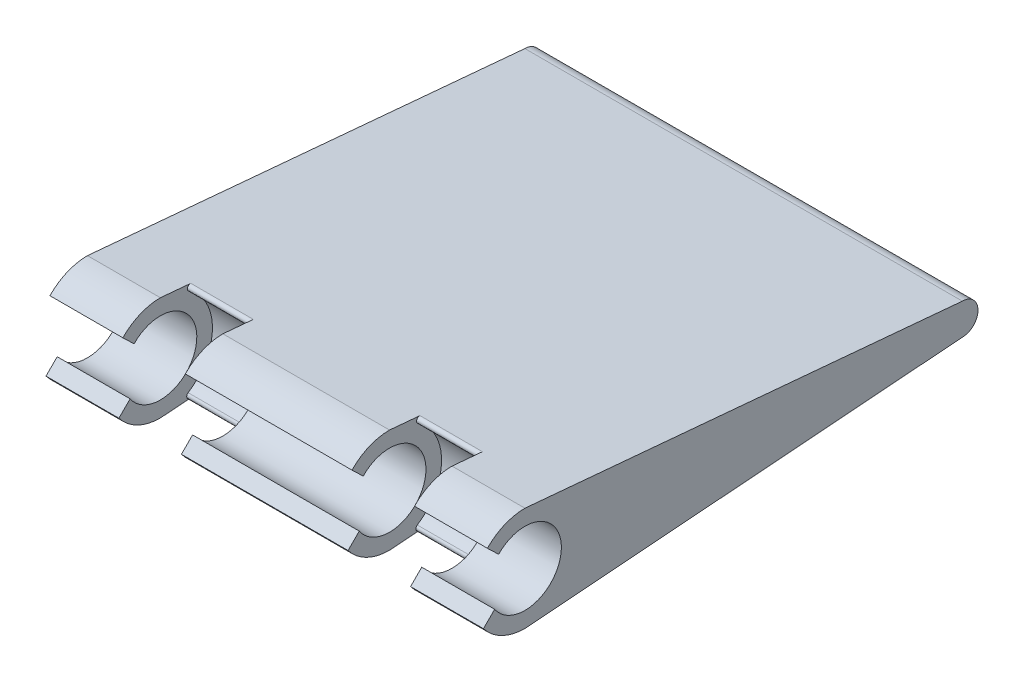
ISO-10303-21;
HEADER;
FILE_DESCRIPTION(('STEP AP214'),'2;1');
FILE_NAME('part.step','',(''),(''),'','','');
FILE_SCHEMA(('AUTOMOTIVE_DESIGN { 1 0 10303 214 1 1 1 1 }'));
ENDSEC;
DATA;
#1=APPLICATION_CONTEXT('core data for automotive mechanical design processes');
#2=APPLICATION_PROTOCOL_DEFINITION('international standard','automotive_design',2000,#1);
#3=PRODUCT_CONTEXT('',#1,'mechanical');
#4=PRODUCT('Part','Part','',(#3));
#5=PRODUCT_RELATED_PRODUCT_CATEGORY('part','',(#4));
#6=PRODUCT_DEFINITION_FORMATION('','',#4);
#7=PRODUCT_DEFINITION_CONTEXT('part definition',#1,'design');
#8=PRODUCT_DEFINITION('design','',#6,#7);
#9=PRODUCT_DEFINITION_SHAPE('','',#8);
#10=(LENGTH_UNIT() NAMED_UNIT(*) SI_UNIT(.MILLI.,.METRE.));
#11=(NAMED_UNIT(*) PLANE_ANGLE_UNIT() SI_UNIT($,.RADIAN.));
#12=(NAMED_UNIT(*) SI_UNIT($,.STERADIAN.) SOLID_ANGLE_UNIT());
#13=UNCERTAINTY_MEASURE_WITH_UNIT(LENGTH_MEASURE(1.E-05),#10,'distance_accuracy_value','');
#14=(GEOMETRIC_REPRESENTATION_CONTEXT(3) GLOBAL_UNCERTAINTY_ASSIGNED_CONTEXT((#13)) GLOBAL_UNIT_ASSIGNED_CONTEXT((#10,
#11,#12)) REPRESENTATION_CONTEXT('',''));
#15=CARTESIAN_POINT('',(0.,0.,0.));
#16=DIRECTION('',(0.,0.,1.));
#17=DIRECTION('',(1.,0.,0.));
#18=AXIS2_PLACEMENT_3D('',#15,#16,#17);
#19=CARTESIAN_POINT('',(21.,0.,0.));
#20=DIRECTION('',(-1.,0.,0.));
#21=DIRECTION('',(0.,0.,1.));
#22=AXIS2_PLACEMENT_3D('',#19,#20,#21);
#23=CYLINDRICAL_SURFACE('',#22,5.);
#24=CARTESIAN_POINT('',(-21.,0.,0.));
#25=DIRECTION('',(1.,0.,0.));
#26=DIRECTION('',(0.,0.,-1.));
#27=AXIS2_PLACEMENT_3D('',#24,#25,#26);
#28=CIRCLE('',#27,5.);
#29=CARTESIAN_POINT('',(-21.,5.,0.));
#30=VERTEX_POINT('',#29);
#31=CARTESIAN_POINT('',(-21.,3.46769077619683,3.60209948234074));
#32=VERTEX_POINT('',#31);
#33=EDGE_CURVE('E343',#30,#32,#28,.T.);
#34=ORIENTED_EDGE('',*,*,#33,.T.);
#35=DIRECTION('',(1.,0.,0.));
#36=VECTOR('',#35,1.);
#37=CARTESIAN_POINT('',(-27.9512556912177,3.46769077619683,3.60209948234074));
#38=LINE('',#37,#36);
#39=CARTESIAN_POINT('',(-14.,3.46769077619683,3.60209948234074));
#40=VERTEX_POINT('',#39);
#41=EDGE_CURVE('E529',#32,#40,#38,.T.);
#42=ORIENTED_EDGE('',*,*,#41,.T.);
#43=CARTESIAN_POINT('',(-14.,0.,0.));
#44=DIRECTION('',(1.,0.,0.));
#45=DIRECTION('',(0.,0.,-1.));
#46=AXIS2_PLACEMENT_3D('',#43,#44,#45);
#47=CIRCLE('',#46,5.);
#48=CARTESIAN_POINT('',(-14.,5.,0.));
#49=VERTEX_POINT('',#48);
#50=EDGE_CURVE('E432',#49,#40,#47,.T.);
#51=ORIENTED_EDGE('',*,*,#50,.F.);
#52=DIRECTION('',(-1.,0.,0.));
#53=VECTOR('',#52,1.);
#54=CARTESIAN_POINT('',(21.,5.,0.));
#55=LINE('',#54,#53);
#56=EDGE_CURVE('E351',#49,#30,#55,.T.);
#57=ORIENTED_EDGE('',*,*,#56,.T.);
#58=EDGE_LOOP('',(#34,#42,#51,#57));
#59=FACE_BOUND('',#58,.T.);
#60=ADVANCED_FACE('F115',(#59),#23,.T.);
#61=CARTESIAN_POINT('',(-8.,0.,0.));
#62=DIRECTION('',(1.,0.,0.));
#63=DIRECTION('',(0.,0.,-1.));
#64=AXIS2_PLACEMENT_3D('',#61,#62,#63);
#65=CIRCLE('',#64,5.);
#66=CARTESIAN_POINT('',(-8.,5.,0.));
#67=VERTEX_POINT('',#66);
#68=CARTESIAN_POINT('',(-8.,3.46769077619683,3.60209948234074));
#69=VERTEX_POINT('',#68);
#70=EDGE_CURVE('E427',#67,#69,#65,.T.);
#71=ORIENTED_EDGE('',*,*,#70,.T.);
#72=CARTESIAN_POINT('',(8.,3.46769077619683,3.60209948234074));
#73=VERTEX_POINT('',#72);
#74=EDGE_CURVE('E518',#69,#73,#38,.T.);
#75=ORIENTED_EDGE('',*,*,#74,.T.);
#76=CARTESIAN_POINT('',(8.,0.,0.));
#77=DIRECTION('',(1.,0.,0.));
#78=DIRECTION('',(0.,0.,-1.));
#79=AXIS2_PLACEMENT_3D('',#76,#77,#78);
#80=CIRCLE('',#79,5.);
#81=CARTESIAN_POINT('',(8.,5.,0.));
#82=VERTEX_POINT('',#81);
#83=EDGE_CURVE('E459',#82,#73,#80,.T.);
#84=ORIENTED_EDGE('',*,*,#83,.F.);
#85=EDGE_CURVE('E357',#82,#67,#55,.T.);
#86=ORIENTED_EDGE('',*,*,#85,.T.);
#87=EDGE_LOOP('',(#71,#75,#84,#86));
#88=FACE_BOUND('',#87,.T.);
#89=ADVANCED_FACE('F526',(#88),#23,.T.);
#90=CARTESIAN_POINT('',(14.,0.,0.));
#91=DIRECTION('',(1.,0.,0.));
#92=DIRECTION('',(0.,0.,-1.));
#93=AXIS2_PLACEMENT_3D('',#90,#91,#92);
#94=CIRCLE('',#93,5.);
#95=CARTESIAN_POINT('',(14.,5.,0.));
#96=VERTEX_POINT('',#95);
#97=CARTESIAN_POINT('',(14.,3.46769077619683,3.60209948234074));
#98=VERTEX_POINT('',#97);
#99=EDGE_CURVE('E463',#96,#98,#94,.T.);
#100=ORIENTED_EDGE('',*,*,#99,.T.);
#101=CARTESIAN_POINT('',(21.,3.46769077619683,3.60209948234074));
#102=VERTEX_POINT('',#101);
#103=EDGE_CURVE('E130',#98,#102,#38,.T.);
#104=ORIENTED_EDGE('',*,*,#103,.T.);
#105=CARTESIAN_POINT('',(21.,0.,0.));
#106=DIRECTION('',(1.,0.,0.));
#107=DIRECTION('',(0.,0.,-1.));
#108=AXIS2_PLACEMENT_3D('',#105,#106,#107);
#109=CIRCLE('',#108,5.);
#110=CARTESIAN_POINT('',(21.,5.,0.));
#111=VERTEX_POINT('',#110);
#112=EDGE_CURVE('E323',#111,#102,#109,.T.);
#113=ORIENTED_EDGE('',*,*,#112,.F.);
#114=EDGE_CURVE('E353',#111,#96,#55,.T.);
#115=ORIENTED_EDGE('',*,*,#114,.T.);
#116=EDGE_LOOP('',(#100,#104,#113,#115));
#117=FACE_BOUND('',#116,.T.);
#118=ADVANCED_FACE('F490',(#117),#23,.T.);
#119=CARTESIAN_POINT('',(-14.,-3.02667931854972,3.97985078899491));
#120=VERTEX_POINT('',#119);
#121=CARTESIAN_POINT('',(-14.,-5.,0.));
#122=VERTEX_POINT('',#121);
#123=EDGE_CURVE('E430',#120,#122,#47,.T.);
#124=ORIENTED_EDGE('',*,*,#123,.F.);
#125=DIRECTION('',(1.,0.,0.));
#126=VECTOR('',#125,1.);
#127=CARTESIAN_POINT('',(-27.9512556912177,-3.02667931854972,3.97985078899491));
#128=LINE('',#127,#126);
#129=CARTESIAN_POINT('',(-21.,-3.02667931854972,3.97985078899491));
#130=VERTEX_POINT('',#129);
#131=EDGE_CURVE('E308',#130,#120,#128,.T.);
#132=ORIENTED_EDGE('',*,*,#131,.F.);
#133=CARTESIAN_POINT('',(-21.,-5.,0.));
#134=VERTEX_POINT('',#133);
#135=EDGE_CURVE('E342',#130,#134,#28,.T.);
#136=ORIENTED_EDGE('',*,*,#135,.T.);
#137=DIRECTION('',(-1.,0.,0.));
#138=VECTOR('',#137,1.);
#139=CARTESIAN_POINT('',(21.,-5.,0.));
#140=LINE('',#139,#138);
#141=EDGE_CURVE('E332',#122,#134,#140,.T.);
#142=ORIENTED_EDGE('',*,*,#141,.F.);
#143=EDGE_LOOP('',(#124,#132,#136,#142));
#144=FACE_BOUND('',#143,.T.);
#145=ADVANCED_FACE('F603',(#144),#23,.T.);
#146=CARTESIAN_POINT('',(21.,0.,0.));
#147=DIRECTION('',(-1.,0.,0.));
#148=DIRECTION('',(0.,0.,1.));
#149=AXIS2_PLACEMENT_3D('',#146,#147,#148);
#150=CYLINDRICAL_SURFACE('',#149,3.5);
#151=DIRECTION('',(1.,0.,0.));
#152=VECTOR('',#151,1.);
#153=CARTESIAN_POINT('',(-27.9512556912177,2.42738354333778,2.52146963763852));
#154=LINE('',#153,#152);
#155=CARTESIAN_POINT('',(-21.,2.42738354333778,2.52146963763852));
#156=VERTEX_POINT('',#155);
#157=CARTESIAN_POINT('',(-14.,2.42738354333778,2.52146963763852));
#158=VERTEX_POINT('',#157);
#159=EDGE_CURVE('E498',#156,#158,#154,.T.);
#160=ORIENTED_EDGE('',*,*,#159,.F.);
#161=CARTESIAN_POINT('',(-21.,0.,0.));
#162=DIRECTION('',(1.,0.,0.));
#163=DIRECTION('',(0.,0.,-1.));
#164=AXIS2_PLACEMENT_3D('',#161,#162,#163);
#165=CIRCLE('',#164,3.5);
#166=CARTESIAN_POINT('',(-21.,-1.95196651601317,2.90513798645837));
#167=VERTEX_POINT('',#166);
#168=EDGE_CURVE('E346',#167,#156,#165,.T.);
#169=ORIENTED_EDGE('',*,*,#168,.F.);
#170=DIRECTION('',(1.,0.,0.));
#171=VECTOR('',#170,1.);
#172=CARTESIAN_POINT('',(-27.9512556912177,-1.95196651601317,2.90513798645837));
#173=LINE('',#172,#171);
#174=CARTESIAN_POINT('',(-14.,-1.95196651601317,2.90513798645837));
#175=VERTEX_POINT('',#174);
#176=EDGE_CURVE('E408',#167,#175,#173,.T.);
#177=ORIENTED_EDGE('',*,*,#176,.T.);
#178=CARTESIAN_POINT('',(-14.,0.,0.));
#179=DIRECTION('',(1.,0.,0.));
#180=DIRECTION('',(0.,0.,-1.));
#181=AXIS2_PLACEMENT_3D('',#178,#179,#180);
#182=CIRCLE('',#181,3.5);
#183=EDGE_CURVE('E419',#175,#158,#182,.T.);
#184=ORIENTED_EDGE('',*,*,#183,.T.);
#185=EDGE_LOOP('',(#160,#169,#177,#184));
#186=FACE_BOUND('',#185,.T.);
#187=ADVANCED_FACE('F418',(#186),#150,.F.);
#188=CARTESIAN_POINT('',(21.,-4.97080969716975,-0.380919204519723));
#189=DIRECTION('',(0.,0.997076696866369,0.0764072023179126));
#190=DIRECTION('',(0.,-0.0764072023179126,0.997076696866369));
#191=AXIS2_PLACEMENT_3D('',#188,#189,#190);
#192=PLANE('',#191);
#193=DIRECTION('',(0.,0.0764072023179126,-0.997076696866369));
#194=VECTOR('',#193,1.);
#195=CARTESIAN_POINT('',(14.,-4.97080969716975,-0.380919204519723));
#196=LINE('',#195,#194);
#197=CARTESIAN_POINT('',(14.,-5.,0.));
#198=VERTEX_POINT('',#197);
#199=CARTESIAN_POINT('',(14.,-4.78152357006746,-2.85101077505653));
#200=VERTEX_POINT('',#199);
#201=EDGE_CURVE('E473',#198,#200,#196,.T.);
#202=ORIENTED_EDGE('',*,*,#201,.T.);
#203=DIRECTION('',(1.,0.,0.));
#204=VECTOR('',#203,1.);
#205=CARTESIAN_POINT('',(8.,-4.78152357006746,-2.85101077505653));
#206=LINE('',#205,#204);
#207=CARTESIAN_POINT('',(8.,-4.78152357006746,-2.85101077505653));
#208=VERTEX_POINT('',#207);
#209=EDGE_CURVE('E372',#200,#208,#206,.F.);
#210=ORIENTED_EDGE('',*,*,#209,.T.);
#211=DIRECTION('',(0.,0.0764072023179126,-0.997076696866369));
#212=VECTOR('',#211,1.);
#213=CARTESIAN_POINT('',(8.,-4.97080969716975,-0.380919204519723));
#214=LINE('',#213,#212);
#215=CARTESIAN_POINT('',(8.,-5.,0.));
#216=VERTEX_POINT('',#215);
#217=EDGE_CURVE('E337',#216,#208,#214,.T.);
#218=ORIENTED_EDGE('',*,*,#217,.F.);
#219=CARTESIAN_POINT('',(-8.,-5.,0.));
#220=VERTEX_POINT('',#219);
#221=EDGE_CURVE('E352',#216,#220,#140,.T.);
#222=ORIENTED_EDGE('',*,*,#221,.T.);
#223=DIRECTION('',(0.,0.0764072023179126,-0.997076696866369));
#224=VECTOR('',#223,1.);
#225=CARTESIAN_POINT('',(-8.,-4.97080969716975,-0.380919204519723));
#226=LINE('',#225,#224);
#227=CARTESIAN_POINT('',(-8.,-4.78152357006746,-2.85101077505653));
#228=VERTEX_POINT('',#227);
#229=EDGE_CURVE('E452',#220,#228,#226,.T.);
#230=ORIENTED_EDGE('',*,*,#229,.T.);
#231=DIRECTION('',(1.,0.,0.));
#232=VECTOR('',#231,1.);
#233=CARTESIAN_POINT('',(21.,-4.78152357006746,-2.85101077505653));
#234=LINE('',#233,#232);
#235=CARTESIAN_POINT('',(-14.,-4.78152357006746,-2.85101077505653));
#236=VERTEX_POINT('',#235);
#237=EDGE_CURVE('E369',#228,#236,#234,.F.);
#238=ORIENTED_EDGE('',*,*,#237,.T.);
#239=DIRECTION('',(0.,0.0764072023179126,-0.997076696866369));
#240=VECTOR('',#239,1.);
#241=CARTESIAN_POINT('',(-14.,-4.97080969716975,-0.380919204519723));
#242=LINE('',#241,#240);
#243=EDGE_CURVE('E447',#122,#236,#242,.T.);
#244=ORIENTED_EDGE('',*,*,#243,.F.);
#245=ORIENTED_EDGE('',*,*,#141,.T.);
#246=DIRECTION('',(0.,0.0764072023179126,-0.997076696866369));
#247=VECTOR('',#246,1.);
#248=CARTESIAN_POINT('',(-21.,-4.97080969716975,-0.380919204519723));
#249=LINE('',#248,#247);
#250=CARTESIAN_POINT('',(-21.,-1.78148881882612,-42.));
#251=VERTEX_POINT('',#250);
#252=EDGE_CURVE('E333',#134,#251,#249,.T.);
#253=ORIENTED_EDGE('',*,*,#252,.T.);
#254=DIRECTION('',(-1.,0.,0.));
#255=VECTOR('',#254,1.);
#256=CARTESIAN_POINT('',(21.,-1.78148881882612,-42.));
#257=LINE('',#256,#255);
#258=CARTESIAN_POINT('',(21.,-1.78148881882612,-42.));
#259=VERTEX_POINT('',#258);
#260=EDGE_CURVE('E360',#259,#251,#257,.T.);
#261=ORIENTED_EDGE('',*,*,#260,.F.);
#262=DIRECTION('',(0.,0.0764072023179126,-0.997076696866369));
#263=VECTOR('',#262,1.);
#264=CARTESIAN_POINT('',(21.,-4.97080969716975,-0.380919204519723));
#265=LINE('',#264,#263);
#266=CARTESIAN_POINT('',(21.,-5.,0.));
#267=VERTEX_POINT('',#266);
#268=EDGE_CURVE('E349',#267,#259,#265,.T.);
#269=ORIENTED_EDGE('',*,*,#268,.F.);
#270=EDGE_CURVE('E321',#267,#198,#140,.T.);
#271=ORIENTED_EDGE('',*,*,#270,.T.);
#272=EDGE_LOOP('',(#202,#210,#218,#222,#230,#238,#244,#245,#253,#261,#269,#271));
#273=FACE_BOUND('',#272,.T.);
#274=ADVANCED_FACE('F539',(#273),#192,.F.);
#275=CARTESIAN_POINT('',(21.,4.95979401552181,-0.446557276508962));
#276=DIRECTION('',(0.,-0.995971286285082,0.0896727210228311));
#277=DIRECTION('',(0.,-0.0896727210228311,-0.995971286285082));
#278=AXIS2_PLACEMENT_3D('',#275,#276,#277);
#279=PLANE('',#278);
#280=DIRECTION('',(0.,0.0896727210228311,0.995971286285082));
#281=VECTOR('',#280,1.);
#282=CARTESIAN_POINT('',(8.,4.95979401552181,-0.446557276508962));
#283=LINE('',#282,#281);
#284=CARTESIAN_POINT('',(8.,4.73670991586197,-2.92429359535429));
#285=VERTEX_POINT('',#284);
#286=EDGE_CURVE('E475',#285,#82,#283,.T.);
#287=ORIENTED_EDGE('',*,*,#286,.F.);
#288=DIRECTION('',(1.,0.,0.));
#289=VECTOR('',#288,1.);
#290=CARTESIAN_POINT('',(14.,4.73670991586197,-2.92429359535429));
#291=LINE('',#290,#289);
#292=CARTESIAN_POINT('',(14.,4.73670991586197,-2.92429359535429));
#293=VERTEX_POINT('',#292);
#294=EDGE_CURVE('E382',#285,#293,#291,.T.);
#295=ORIENTED_EDGE('',*,*,#294,.T.);
#296=DIRECTION('',(0.,0.0896727210228311,0.995971286285082));
#297=VECTOR('',#296,1.);
#298=CARTESIAN_POINT('',(14.,4.95979401552181,-0.446557276508962));
#299=LINE('',#298,#297);
#300=EDGE_CURVE('E470',#293,#96,#299,.T.);
#301=ORIENTED_EDGE('',*,*,#300,.T.);
#302=ORIENTED_EDGE('',*,*,#114,.F.);
#303=DIRECTION('',(0.,0.0896727210228311,0.995971286285082));
#304=VECTOR('',#303,1.);
#305=CARTESIAN_POINT('',(21.,4.95979401552181,-0.446557276508962));
#306=LINE('',#305,#304);
#307=CARTESIAN_POINT('',(21.,1.21851118117388,-42.));
#308=VERTEX_POINT('',#307);
#309=EDGE_CURVE('E324',#308,#111,#306,.T.);
#310=ORIENTED_EDGE('',*,*,#309,.F.);
#311=DIRECTION('',(-1.,0.,0.));
#312=VECTOR('',#311,1.);
#313=CARTESIAN_POINT('',(21.,1.21851118117388,-42.));
#314=LINE('',#313,#312);
#315=CARTESIAN_POINT('',(-21.,1.21851118117388,-42.));
#316=VERTEX_POINT('',#315);
#317=EDGE_CURVE('E356',#308,#316,#314,.T.);
#318=ORIENTED_EDGE('',*,*,#317,.T.);
#319=DIRECTION('',(0.,0.0896727210228311,0.995971286285082));
#320=VECTOR('',#319,1.);
#321=CARTESIAN_POINT('',(-21.,4.95979401552181,-0.446557276508962));
#322=LINE('',#321,#320);
#323=EDGE_CURVE('E339',#316,#30,#322,.T.);
#324=ORIENTED_EDGE('',*,*,#323,.T.);
#325=ORIENTED_EDGE('',*,*,#56,.F.);
#326=DIRECTION('',(0.,0.0896727210228311,0.995971286285082));
#327=VECTOR('',#326,1.);
#328=CARTESIAN_POINT('',(-14.,4.95979401552181,-0.446557276508962));
#329=LINE('',#328,#327);
#330=CARTESIAN_POINT('',(-14.,4.73670991586197,-2.92429359535429));
#331=VERTEX_POINT('',#330);
#332=EDGE_CURVE('E445',#331,#49,#329,.T.);
#333=ORIENTED_EDGE('',*,*,#332,.F.);
#334=DIRECTION('',(1.,0.,0.));
#335=VECTOR('',#334,1.);
#336=CARTESIAN_POINT('',(21.,4.73670991586197,-2.92429359535429));
#337=LINE('',#336,#335);
#338=CARTESIAN_POINT('',(-8.,4.73670991586197,-2.92429359535429));
#339=VERTEX_POINT('',#338);
#340=EDGE_CURVE('E379',#331,#339,#337,.T.);
#341=ORIENTED_EDGE('',*,*,#340,.T.);
#342=DIRECTION('',(0.,0.0896727210228311,0.995971286285082));
#343=VECTOR('',#342,1.);
#344=CARTESIAN_POINT('',(-8.,4.95979401552181,-0.446557276508962));
#345=LINE('',#344,#343);
#346=EDGE_CURVE('E449',#339,#67,#345,.T.);
#347=ORIENTED_EDGE('',*,*,#346,.T.);
#348=ORIENTED_EDGE('',*,*,#85,.F.);
#349=EDGE_LOOP('',(#287,#295,#301,#302,#310,#318,#324,#325,#333,#341,#347,#348));
#350=FACE_BOUND('',#349,.T.);
#351=ADVANCED_FACE('F486',(#350),#279,.F.);
#352=CARTESIAN_POINT('',(8.,-3.02667931854972,3.97985078899491));
#353=VERTEX_POINT('',#352);
#354=EDGE_CURVE('E469',#353,#216,#80,.T.);
#355=ORIENTED_EDGE('',*,*,#354,.F.);
#356=CARTESIAN_POINT('',(-8.,-3.02667931854972,3.97985078899491));
#357=VERTEX_POINT('',#356);
#358=EDGE_CURVE('E305',#357,#353,#128,.T.);
#359=ORIENTED_EDGE('',*,*,#358,.F.);
#360=EDGE_CURVE('E434',#357,#220,#65,.T.);
#361=ORIENTED_EDGE('',*,*,#360,.T.);
#362=ORIENTED_EDGE('',*,*,#221,.F.);
#363=EDGE_LOOP('',(#355,#359,#361,#362));
#364=FACE_BOUND('',#363,.T.);
#365=ADVANCED_FACE('F542',(#364),#23,.T.);
#366=CARTESIAN_POINT('',(-8.,2.42738354333778,2.52146963763852));
#367=VERTEX_POINT('',#366);
#368=CARTESIAN_POINT('',(8.,2.42738354333778,2.52146963763852));
#369=VERTEX_POINT('',#368);
#370=EDGE_CURVE('E520',#367,#369,#154,.T.);
#371=ORIENTED_EDGE('',*,*,#370,.F.);
#372=CARTESIAN_POINT('',(-8.,0.,0.));
#373=DIRECTION('',(1.,0.,0.));
#374=DIRECTION('',(0.,0.,-1.));
#375=AXIS2_PLACEMENT_3D('',#372,#373,#374);
#376=CIRCLE('',#375,3.5);
#377=CARTESIAN_POINT('',(-8.,-1.95196651601317,2.90513798645837));
#378=VERTEX_POINT('',#377);
#379=EDGE_CURVE('E441',#378,#367,#376,.T.);
#380=ORIENTED_EDGE('',*,*,#379,.F.);
#381=CARTESIAN_POINT('',(8.,-1.95196651601317,2.90513798645837));
#382=VERTEX_POINT('',#381);
#383=EDGE_CURVE('E421',#378,#382,#173,.T.);
#384=ORIENTED_EDGE('',*,*,#383,.T.);
#385=CARTESIAN_POINT('',(8.,0.,0.));
#386=DIRECTION('',(1.,0.,0.));
#387=DIRECTION('',(0.,0.,-1.));
#388=AXIS2_PLACEMENT_3D('',#385,#386,#387);
#389=CIRCLE('',#388,3.5);
#390=EDGE_CURVE('E454',#382,#369,#389,.T.);
#391=ORIENTED_EDGE('',*,*,#390,.T.);
#392=EDGE_LOOP('',(#371,#380,#384,#391));
#393=FACE_BOUND('',#392,.T.);
#394=ADVANCED_FACE('F599',(#393),#150,.F.);
#395=CARTESIAN_POINT('',(21.,-0.28148881882612,-42.));
#396=DIRECTION('',(-1.,0.,0.));
#397=DIRECTION('',(0.,0.,1.));
#398=AXIS2_PLACEMENT_3D('',#395,#396,#397);
#399=CYLINDRICAL_SURFACE('',#398,1.5);
#400=CARTESIAN_POINT('',(-21.,-0.28148881882612,-42.));
#401=DIRECTION('',(1.,0.,0.));
#402=DIRECTION('',(0.,0.,-1.));
#403=AXIS2_PLACEMENT_3D('',#400,#401,#402);
#404=CIRCLE('',#403,1.5);
#405=EDGE_CURVE('E336',#251,#316,#404,.T.);
#406=ORIENTED_EDGE('',*,*,#405,.T.);
#407=ORIENTED_EDGE('',*,*,#317,.F.);
#408=CARTESIAN_POINT('',(21.,-0.28148881882612,-42.));
#409=DIRECTION('',(1.,0.,0.));
#410=DIRECTION('',(0.,0.,-1.));
#411=AXIS2_PLACEMENT_3D('',#408,#409,#410);
#412=CIRCLE('',#411,1.5);
#413=EDGE_CURVE('E327',#259,#308,#412,.T.);
#414=ORIENTED_EDGE('',*,*,#413,.F.);
#415=ORIENTED_EDGE('',*,*,#260,.T.);
#416=EDGE_LOOP('',(#406,#407,#414,#415));
#417=FACE_BOUND('',#416,.T.);
#418=ADVANCED_FACE('F483',(#417),#399,.T.);
#419=CARTESIAN_POINT('',(21.,-3.02667931854972,3.97985078899491));
#420=VERTEX_POINT('',#419);
#421=EDGE_CURVE('E314',#420,#267,#109,.T.);
#422=ORIENTED_EDGE('',*,*,#421,.F.);
#423=CARTESIAN_POINT('',(14.,-3.02667931854972,3.97985078899491));
#424=VERTEX_POINT('',#423);
#425=EDGE_CURVE('E297',#424,#420,#128,.T.);
#426=ORIENTED_EDGE('',*,*,#425,.F.);
#427=EDGE_CURVE('E462',#424,#198,#94,.T.);
#428=ORIENTED_EDGE('',*,*,#427,.T.);
#429=ORIENTED_EDGE('',*,*,#270,.F.);
#430=EDGE_LOOP('',(#422,#426,#428,#429));
#431=FACE_BOUND('',#430,.T.);
#432=ADVANCED_FACE('F319',(#431),#23,.T.);
#433=CARTESIAN_POINT('',(14.,2.42738354333778,2.52146963763852));
#434=VERTEX_POINT('',#433);
#435=CARTESIAN_POINT('',(21.,2.42738354333778,2.52146963763852));
#436=VERTEX_POINT('',#435);
#437=EDGE_CURVE('E420',#434,#436,#154,.T.);
#438=ORIENTED_EDGE('',*,*,#437,.F.);
#439=CARTESIAN_POINT('',(14.,0.,0.));
#440=DIRECTION('',(1.,0.,0.));
#441=DIRECTION('',(0.,0.,-1.));
#442=AXIS2_PLACEMENT_3D('',#439,#440,#441);
#443=CIRCLE('',#442,3.5);
#444=CARTESIAN_POINT('',(14.,-1.95196651601317,2.90513798645837));
#445=VERTEX_POINT('',#444);
#446=EDGE_CURVE('E455',#445,#434,#443,.T.);
#447=ORIENTED_EDGE('',*,*,#446,.F.);
#448=CARTESIAN_POINT('',(21.,-1.95196651601317,2.90513798645837));
#449=VERTEX_POINT('',#448);
#450=EDGE_CURVE('E138',#445,#449,#173,.T.);
#451=ORIENTED_EDGE('',*,*,#450,.T.);
#452=CARTESIAN_POINT('',(21.,0.,0.));
#453=DIRECTION('',(1.,0.,0.));
#454=DIRECTION('',(0.,0.,-1.));
#455=AXIS2_PLACEMENT_3D('',#452,#453,#454);
#456=CIRCLE('',#455,3.5);
#457=EDGE_CURVE('E317',#449,#436,#456,.T.);
#458=ORIENTED_EDGE('',*,*,#457,.T.);
#459=EDGE_LOOP('',(#438,#447,#451,#458));
#460=FACE_BOUND('',#459,.T.);
#461=ADVANCED_FACE('F494',(#460),#150,.F.);
#462=CARTESIAN_POINT('',(21.,0.,0.));
#463=DIRECTION('',(1.,0.,0.));
#464=DIRECTION('',(0.,0.,-1.));
#465=AXIS2_PLACEMENT_3D('',#462,#463,#464);
#466=PLANE('',#465);
#467=DIRECTION('',(0.,0.693538155239366,0.720419896468148));
#468=VECTOR('',#467,1.);
#469=CARTESIAN_POINT('',(21.,3.46769077619683,3.60209948234074));
#470=LINE('',#469,#468);
#471=EDGE_CURVE('E306',#436,#102,#470,.T.);
#472=ORIENTED_EDGE('',*,*,#471,.F.);
#473=ORIENTED_EDGE('',*,*,#457,.F.);
#474=DIRECTION('',(0.,0.707106781186549,-0.707106781186546));
#475=VECTOR('',#474,1.);
#476=CARTESIAN_POINT('',(21.,-3.02667931854972,3.97985078899491));
#477=LINE('',#476,#475);
#478=EDGE_CURVE('E300',#420,#449,#477,.T.);
#479=ORIENTED_EDGE('',*,*,#478,.F.);
#480=ORIENTED_EDGE('',*,*,#421,.T.);
#481=ORIENTED_EDGE('',*,*,#268,.T.);
#482=ORIENTED_EDGE('',*,*,#413,.T.);
#483=ORIENTED_EDGE('',*,*,#309,.T.);
#484=ORIENTED_EDGE('',*,*,#112,.T.);
#485=EDGE_LOOP('',(#472,#473,#479,#480,#481,#482,#483,#484));
#486=FACE_BOUND('',#485,.T.);
#487=ADVANCED_FACE('F312',(#486),#466,.T.);
#488=CARTESIAN_POINT('',(-21.,0.,0.));
#489=DIRECTION('',(1.,0.,0.));
#490=DIRECTION('',(0.,0.,-1.));
#491=AXIS2_PLACEMENT_3D('',#488,#489,#490);
#492=PLANE('',#491);
#493=ORIENTED_EDGE('',*,*,#168,.T.);
#494=DIRECTION('',(0.,-0.693538155239366,-0.720419896468148));
#495=VECTOR('',#494,1.);
#496=CARTESIAN_POINT('',(-21.,3.46769077619683,3.60209948234074));
#497=LINE('',#496,#495);
#498=EDGE_CURVE('E504',#32,#156,#497,.T.);
#499=ORIENTED_EDGE('',*,*,#498,.F.);
#500=ORIENTED_EDGE('',*,*,#33,.F.);
#501=ORIENTED_EDGE('',*,*,#323,.F.);
#502=ORIENTED_EDGE('',*,*,#405,.F.);
#503=ORIENTED_EDGE('',*,*,#252,.F.);
#504=ORIENTED_EDGE('',*,*,#135,.F.);
#505=DIRECTION('',(0.,-0.707106781186549,0.707106781186546));
#506=VECTOR('',#505,1.);
#507=CARTESIAN_POINT('',(-21.,-3.02667931854972,3.97985078899491));
#508=LINE('',#507,#506);
#509=EDGE_CURVE('E501',#167,#130,#508,.T.);
#510=ORIENTED_EDGE('',*,*,#509,.F.);
#511=EDGE_LOOP('',(#493,#499,#500,#501,#502,#503,#504,#510));
#512=FACE_BOUND('',#511,.T.);
#513=ADVANCED_FACE('F552',(#512),#492,.F.);
#514=CARTESIAN_POINT('',(14.,0.,0.));
#515=DIRECTION('',(-1.,0.,0.));
#516=DIRECTION('',(0.,0.,1.));
#517=AXIS2_PLACEMENT_3D('',#514,#515,#516);
#518=CYLINDRICAL_SURFACE('',#517,5.);
#519=CARTESIAN_POINT('',(8.,-4.22867977453543,-2.6680081267558));
#520=VERTEX_POINT('',#519);
#521=CARTESIAN_POINT('',(8.,4.1867155943174,-2.73338847079947));
#522=VERTEX_POINT('',#521);
#523=EDGE_CURVE('E466',#520,#522,#80,.T.);
#524=ORIENTED_EDGE('',*,*,#523,.F.);
#525=DIRECTION('',(-1.,0.,0.));
#526=VECTOR('',#525,1.);
#527=CARTESIAN_POINT('',(14.,-4.22867977453543,-2.6680081267558));
#528=LINE('',#527,#526);
#529=CARTESIAN_POINT('',(14.,-4.22867977453543,-2.6680081267558));
#530=VERTEX_POINT('',#529);
#531=EDGE_CURVE('E366',#520,#530,#528,.F.);
#532=ORIENTED_EDGE('',*,*,#531,.T.);
#533=CARTESIAN_POINT('',(14.,4.1867155943174,-2.73338847079947));
#534=VERTEX_POINT('',#533);
#535=EDGE_CURVE('E458',#530,#534,#94,.T.);
#536=ORIENTED_EDGE('',*,*,#535,.T.);
#537=DIRECTION('',(-1.,0.,0.));
#538=VECTOR('',#537,1.);
#539=CARTESIAN_POINT('',(14.,4.1867155943174,-2.73338847079947));
#540=LINE('',#539,#538);
#541=EDGE_CURVE('E363',#534,#522,#540,.T.);
#542=ORIENTED_EDGE('',*,*,#541,.T.);
#543=EDGE_LOOP('',(#524,#532,#536,#542));
#544=FACE_BOUND('',#543,.T.);
#545=ADVANCED_FACE('F562',(#544),#518,.F.);
#546=CARTESIAN_POINT('',(8.,0.,0.));
#547=DIRECTION('',(1.,0.,0.));
#548=DIRECTION('',(0.,0.,-1.));
#549=AXIS2_PLACEMENT_3D('',#546,#547,#548);
#550=PLANE('',#549);
#551=DIRECTION('',(0.,0.693538155239366,0.720419896468148));
#552=VECTOR('',#551,1.);
#553=CARTESIAN_POINT('',(8.,0.,0.));
#554=LINE('',#553,#552);
#555=EDGE_CURVE('E438',#369,#73,#554,.T.);
#556=ORIENTED_EDGE('',*,*,#555,.F.);
#557=ORIENTED_EDGE('',*,*,#390,.F.);
#558=DIRECTION('',(0.,0.707106781186549,-0.707106781186546));
#559=VECTOR('',#558,1.);
#560=CARTESIAN_POINT('',(8.,0.476585735222603,0.476585735222605));
#561=LINE('',#560,#559);
#562=EDGE_CURVE('E508',#353,#382,#561,.T.);
#563=ORIENTED_EDGE('',*,*,#562,.F.);
#564=ORIENTED_EDGE('',*,*,#354,.T.);
#565=ORIENTED_EDGE('',*,*,#217,.T.);
#566=CARTESIAN_POINT('',(8.,-4.48240056100755,-2.82808861436115));
#567=DIRECTION('',(1.,0.,0.));
#568=DIRECTION('',(0.,0.,-1.));
#569=AXIS2_PLACEMENT_3D('',#566,#567,#568);
#570=CIRCLE('',#569,0.3);
#571=EDGE_CURVE('E388',#208,#520,#570,.F.);
#572=ORIENTED_EDGE('',*,*,#571,.T.);
#573=ORIENTED_EDGE('',*,*,#523,.T.);
#574=CARTESIAN_POINT('',(8.,4.43791852997645,-2.89739177904744));
#575=DIRECTION('',(1.,0.,0.));
#576=DIRECTION('',(0.,0.,-1.));
#577=AXIS2_PLACEMENT_3D('',#574,#575,#576);
#578=CIRCLE('',#577,0.3);
#579=EDGE_CURVE('E395',#522,#285,#578,.F.);
#580=ORIENTED_EDGE('',*,*,#579,.T.);
#581=ORIENTED_EDGE('',*,*,#286,.T.);
#582=ORIENTED_EDGE('',*,*,#83,.T.);
#583=EDGE_LOOP('',(#556,#557,#563,#564,#565,#572,#573,#580,#581,#582));
#584=FACE_BOUND('',#583,.T.);
#585=ADVANCED_FACE('F530',(#584),#550,.T.);
#586=CARTESIAN_POINT('',(14.,0.,0.));
#587=DIRECTION('',(1.,0.,0.));
#588=DIRECTION('',(0.,0.,-1.));
#589=AXIS2_PLACEMENT_3D('',#586,#587,#588);
#590=PLANE('',#589);
#591=ORIENTED_EDGE('',*,*,#446,.T.);
#592=DIRECTION('',(0.,0.693538155239366,0.720419896468148));
#593=VECTOR('',#592,1.);
#594=CARTESIAN_POINT('',(14.,0.,0.));
#595=LINE('',#594,#593);
#596=EDGE_CURVE('E512',#434,#98,#595,.T.);
#597=ORIENTED_EDGE('',*,*,#596,.T.);
#598=ORIENTED_EDGE('',*,*,#99,.F.);
#599=ORIENTED_EDGE('',*,*,#300,.F.);
#600=CARTESIAN_POINT('',(14.,4.43791852997645,-2.89739177904744));
#601=DIRECTION('',(1.,0.,0.));
#602=DIRECTION('',(0.,0.,-1.));
#603=AXIS2_PLACEMENT_3D('',#600,#601,#602);
#604=CIRCLE('',#603,0.3);
#605=EDGE_CURVE('E398',#293,#534,#604,.T.);
#606=ORIENTED_EDGE('',*,*,#605,.T.);
#607=ORIENTED_EDGE('',*,*,#535,.F.);
#608=CARTESIAN_POINT('',(14.,-4.48240056100755,-2.82808861436115));
#609=DIRECTION('',(1.,0.,0.));
#610=DIRECTION('',(0.,0.,-1.));
#611=AXIS2_PLACEMENT_3D('',#608,#609,#610);
#612=CIRCLE('',#611,0.3);
#613=EDGE_CURVE('E385',#530,#200,#612,.T.);
#614=ORIENTED_EDGE('',*,*,#613,.T.);
#615=ORIENTED_EDGE('',*,*,#201,.F.);
#616=ORIENTED_EDGE('',*,*,#427,.F.);
#617=DIRECTION('',(0.,0.707106781186549,-0.707106781186546));
#618=VECTOR('',#617,1.);
#619=CARTESIAN_POINT('',(14.,0.476585735222603,0.476585735222605));
#620=LINE('',#619,#618);
#621=EDGE_CURVE('E301',#424,#445,#620,.T.);
#622=ORIENTED_EDGE('',*,*,#621,.T.);
#623=EDGE_LOOP('',(#591,#597,#598,#599,#606,#607,#614,#615,#616,#622));
#624=FACE_BOUND('',#623,.T.);
#625=ADVANCED_FACE('F556',(#624),#590,.F.);
#626=CARTESIAN_POINT('',(-14.,0.,0.));
#627=DIRECTION('',(1.,0.,0.));
#628=DIRECTION('',(0.,0.,-1.));
#629=AXIS2_PLACEMENT_3D('',#626,#627,#628);
#630=CYLINDRICAL_SURFACE('',#629,5.);
#631=CARTESIAN_POINT('',(-14.,-4.22867977453543,-2.6680081267558));
#632=VERTEX_POINT('',#631);
#633=CARTESIAN_POINT('',(-14.,4.1867155943174,-2.73338847079947));
#634=VERTEX_POINT('',#633);
#635=EDGE_CURVE('E426',#632,#634,#47,.T.);
#636=ORIENTED_EDGE('',*,*,#635,.F.);
#637=DIRECTION('',(1.,0.,0.));
#638=VECTOR('',#637,1.);
#639=CARTESIAN_POINT('',(-14.,-4.22867977453543,-2.6680081267558));
#640=LINE('',#639,#638);
#641=CARTESIAN_POINT('',(-8.,-4.22867977453543,-2.6680081267558));
#642=VERTEX_POINT('',#641);
#643=EDGE_CURVE('E377',#632,#642,#640,.T.);
#644=ORIENTED_EDGE('',*,*,#643,.T.);
#645=CARTESIAN_POINT('',(-8.,4.1867155943174,-2.73338847079947));
#646=VERTEX_POINT('',#645);
#647=EDGE_CURVE('E436',#642,#646,#65,.T.);
#648=ORIENTED_EDGE('',*,*,#647,.T.);
#649=DIRECTION('',(1.,0.,0.));
#650=VECTOR('',#649,1.);
#651=CARTESIAN_POINT('',(-14.,4.1867155943174,-2.73338847079947));
#652=LINE('',#651,#650);
#653=EDGE_CURVE('E375',#646,#634,#652,.F.);
#654=ORIENTED_EDGE('',*,*,#653,.T.);
#655=EDGE_LOOP('',(#636,#644,#648,#654));
#656=FACE_BOUND('',#655,.T.);
#657=ADVANCED_FACE('F624',(#656),#630,.F.);
#658=CARTESIAN_POINT('',(-8.,0.,0.));
#659=DIRECTION('',(1.,0.,0.));
#660=DIRECTION('',(0.,0.,-1.));
#661=AXIS2_PLACEMENT_3D('',#658,#659,#660);
#662=PLANE('',#661);
#663=ORIENTED_EDGE('',*,*,#379,.T.);
#664=DIRECTION('',(0.,0.693538155239366,0.720419896468148));
#665=VECTOR('',#664,1.);
#666=CARTESIAN_POINT('',(-8.,0.,0.));
#667=LINE('',#666,#665);
#668=EDGE_CURVE('E510',#367,#69,#667,.T.);
#669=ORIENTED_EDGE('',*,*,#668,.T.);
#670=ORIENTED_EDGE('',*,*,#70,.F.);
#671=ORIENTED_EDGE('',*,*,#346,.F.);
#672=CARTESIAN_POINT('',(-8.,4.43791852997645,-2.89739177904744));
#673=DIRECTION('',(1.,0.,0.));
#674=DIRECTION('',(0.,0.,-1.));
#675=AXIS2_PLACEMENT_3D('',#672,#673,#674);
#676=CIRCLE('',#675,0.3);
#677=EDGE_CURVE('E400',#339,#646,#676,.T.);
#678=ORIENTED_EDGE('',*,*,#677,.T.);
#679=ORIENTED_EDGE('',*,*,#647,.F.);
#680=CARTESIAN_POINT('',(-8.,-4.48240056100755,-2.82808861436115));
#681=DIRECTION('',(1.,0.,0.));
#682=DIRECTION('',(0.,0.,-1.));
#683=AXIS2_PLACEMENT_3D('',#680,#681,#682);
#684=CIRCLE('',#683,0.3);
#685=EDGE_CURVE('E392',#642,#228,#684,.T.);
#686=ORIENTED_EDGE('',*,*,#685,.T.);
#687=ORIENTED_EDGE('',*,*,#229,.F.);
#688=ORIENTED_EDGE('',*,*,#360,.F.);
#689=DIRECTION('',(0.,0.707106781186549,-0.707106781186546));
#690=VECTOR('',#689,1.);
#691=CARTESIAN_POINT('',(-8.,0.476585735222603,0.476585735222605));
#692=LINE('',#691,#690);
#693=EDGE_CURVE('E503',#357,#378,#692,.T.);
#694=ORIENTED_EDGE('',*,*,#693,.T.);
#695=EDGE_LOOP('',(#663,#669,#670,#671,#678,#679,#686,#687,#688,#694));
#696=FACE_BOUND('',#695,.T.);
#697=ADVANCED_FACE('F620',(#696),#662,.F.);
#698=CARTESIAN_POINT('',(-14.,0.,0.));
#699=DIRECTION('',(1.,0.,0.));
#700=DIRECTION('',(0.,0.,-1.));
#701=AXIS2_PLACEMENT_3D('',#698,#699,#700);
#702=PLANE('',#701);
#703=DIRECTION('',(0.,0.693538155239366,0.720419896468148));
#704=VECTOR('',#703,1.);
#705=CARTESIAN_POINT('',(-14.,0.,0.));
#706=LINE('',#705,#704);
#707=EDGE_CURVE('E12',#158,#40,#706,.T.);
#708=ORIENTED_EDGE('',*,*,#707,.F.);
#709=ORIENTED_EDGE('',*,*,#183,.F.);
#710=DIRECTION('',(0.,0.707106781186549,-0.707106781186546));
#711=VECTOR('',#710,1.);
#712=CARTESIAN_POINT('',(-14.,0.476585735222603,0.476585735222605));
#713=LINE('',#712,#711);
#714=EDGE_CURVE('E123',#120,#175,#713,.T.);
#715=ORIENTED_EDGE('',*,*,#714,.F.);
#716=ORIENTED_EDGE('',*,*,#123,.T.);
#717=ORIENTED_EDGE('',*,*,#243,.T.);
#718=CARTESIAN_POINT('',(-14.,-4.48240056100755,-2.82808861436115));
#719=DIRECTION('',(1.,0.,0.));
#720=DIRECTION('',(0.,0.,-1.));
#721=AXIS2_PLACEMENT_3D('',#718,#719,#720);
#722=CIRCLE('',#721,0.3);
#723=EDGE_CURVE('E390',#236,#632,#722,.F.);
#724=ORIENTED_EDGE('',*,*,#723,.T.);
#725=ORIENTED_EDGE('',*,*,#635,.T.);
#726=CARTESIAN_POINT('',(-14.,4.43791852997645,-2.89739177904744));
#727=DIRECTION('',(1.,0.,0.));
#728=DIRECTION('',(0.,0.,-1.));
#729=AXIS2_PLACEMENT_3D('',#726,#727,#728);
#730=CIRCLE('',#729,0.3);
#731=EDGE_CURVE('E402',#634,#331,#730,.F.);
#732=ORIENTED_EDGE('',*,*,#731,.T.);
#733=ORIENTED_EDGE('',*,*,#332,.T.);
#734=ORIENTED_EDGE('',*,*,#50,.T.);
#735=EDGE_LOOP('',(#708,#709,#715,#716,#717,#724,#725,#732,#733,#734));
#736=FACE_BOUND('',#735,.T.);
#737=ADVANCED_FACE('F424',(#736),#702,.T.);
#738=CARTESIAN_POINT('',(14.,-4.48240056100755,-2.82808861436115));
#739=DIRECTION('',(-1.,0.,0.));
#740=DIRECTION('',(0.,0.,1.));
#741=AXIS2_PLACEMENT_3D('',#738,#739,#740);
#742=CYLINDRICAL_SURFACE('',#741,0.3);
#743=ORIENTED_EDGE('',*,*,#571,.F.);
#744=ORIENTED_EDGE('',*,*,#209,.F.);
#745=ORIENTED_EDGE('',*,*,#613,.F.);
#746=ORIENTED_EDGE('',*,*,#531,.F.);
#747=EDGE_LOOP('',(#743,#744,#745,#746));
#748=FACE_BOUND('',#747,.T.);
#749=ADVANCED_FACE('F559',(#748),#742,.T.);
#750=CARTESIAN_POINT('',(-14.,-4.48240056100755,-2.82808861436115));
#751=DIRECTION('',(1.,0.,0.));
#752=DIRECTION('',(0.,0.,-1.));
#753=AXIS2_PLACEMENT_3D('',#750,#751,#752);
#754=CYLINDRICAL_SURFACE('',#753,0.3);
#755=ORIENTED_EDGE('',*,*,#685,.F.);
#756=ORIENTED_EDGE('',*,*,#643,.F.);
#757=ORIENTED_EDGE('',*,*,#723,.F.);
#758=ORIENTED_EDGE('',*,*,#237,.F.);
#759=EDGE_LOOP('',(#755,#756,#757,#758));
#760=FACE_BOUND('',#759,.T.);
#761=ADVANCED_FACE('F628',(#760),#754,.T.);
#762=CARTESIAN_POINT('',(14.,4.43791852997645,-2.89739177904744));
#763=DIRECTION('',(-1.,0.,0.));
#764=DIRECTION('',(0.,0.,1.));
#765=AXIS2_PLACEMENT_3D('',#762,#763,#764);
#766=CYLINDRICAL_SURFACE('',#765,0.3);
#767=ORIENTED_EDGE('',*,*,#605,.F.);
#768=ORIENTED_EDGE('',*,*,#294,.F.);
#769=ORIENTED_EDGE('',*,*,#579,.F.);
#770=ORIENTED_EDGE('',*,*,#541,.F.);
#771=EDGE_LOOP('',(#767,#768,#769,#770));
#772=FACE_BOUND('',#771,.T.);
#773=ADVANCED_FACE('F566',(#772),#766,.T.);
#774=CARTESIAN_POINT('',(-14.,4.43791852997645,-2.89739177904744));
#775=DIRECTION('',(1.,0.,0.));
#776=DIRECTION('',(0.,0.,-1.));
#777=AXIS2_PLACEMENT_3D('',#774,#775,#776);
#778=CYLINDRICAL_SURFACE('',#777,0.3);
#779=ORIENTED_EDGE('',*,*,#731,.F.);
#780=ORIENTED_EDGE('',*,*,#653,.F.);
#781=ORIENTED_EDGE('',*,*,#677,.F.);
#782=ORIENTED_EDGE('',*,*,#340,.F.);
#783=EDGE_LOOP('',(#779,#780,#781,#782));
#784=FACE_BOUND('',#783,.T.);
#785=ADVANCED_FACE('F117',(#784),#778,.T.);
#786=CARTESIAN_POINT('',(-27.9512556912177,-3.02667931854972,3.97985078899491));
#787=DIRECTION('',(0.,-0.707106781186546,-0.707106781186549));
#788=DIRECTION('',(0.,0.707106781186549,-0.707106781186546));
#789=AXIS2_PLACEMENT_3D('',#786,#787,#788);
#790=PLANE('',#789);
#791=ORIENTED_EDGE('',*,*,#714,.T.);
#792=ORIENTED_EDGE('',*,*,#176,.F.);
#793=ORIENTED_EDGE('',*,*,#509,.T.);
#794=ORIENTED_EDGE('',*,*,#131,.T.);
#795=EDGE_LOOP('',(#791,#792,#793,#794));
#796=FACE_BOUND('',#795,.T.);
#797=ADVANCED_FACE('F407',(#796),#790,.F.);
#798=CARTESIAN_POINT('',(-27.9512556912177,3.46769077619683,3.60209948234074));
#799=DIRECTION('',(0.,0.720419896468148,-0.693538155239366));
#800=DIRECTION('',(0.,0.693538155239366,0.720419896468148));
#801=AXIS2_PLACEMENT_3D('',#798,#799,#800);
#802=PLANE('',#801);
#803=ORIENTED_EDGE('',*,*,#707,.T.);
#804=ORIENTED_EDGE('',*,*,#41,.F.);
#805=ORIENTED_EDGE('',*,*,#498,.T.);
#806=ORIENTED_EDGE('',*,*,#159,.T.);
#807=EDGE_LOOP('',(#803,#804,#805,#806));
#808=FACE_BOUND('',#807,.T.);
#809=ADVANCED_FACE('F578',(#808),#802,.F.);
#810=ORIENTED_EDGE('',*,*,#562,.T.);
#811=ORIENTED_EDGE('',*,*,#383,.F.);
#812=ORIENTED_EDGE('',*,*,#693,.F.);
#813=ORIENTED_EDGE('',*,*,#358,.T.);
#814=EDGE_LOOP('',(#810,#811,#812,#813));
#815=FACE_BOUND('',#814,.T.);
#816=ADVANCED_FACE('F583',(#815),#790,.F.);
#817=ORIENTED_EDGE('',*,*,#555,.T.);
#818=ORIENTED_EDGE('',*,*,#74,.F.);
#819=ORIENTED_EDGE('',*,*,#668,.F.);
#820=ORIENTED_EDGE('',*,*,#370,.T.);
#821=EDGE_LOOP('',(#817,#818,#819,#820));
#822=FACE_BOUND('',#821,.T.);
#823=ADVANCED_FACE('F517',(#822),#802,.F.);
#824=ORIENTED_EDGE('',*,*,#425,.T.);
#825=ORIENTED_EDGE('',*,*,#478,.T.);
#826=ORIENTED_EDGE('',*,*,#450,.F.);
#827=ORIENTED_EDGE('',*,*,#621,.F.);
#828=EDGE_LOOP('',(#824,#825,#826,#827));
#829=FACE_BOUND('',#828,.T.);
#830=ADVANCED_FACE('F299',(#829),#790,.F.);
#831=ORIENTED_EDGE('',*,*,#437,.T.);
#832=ORIENTED_EDGE('',*,*,#471,.T.);
#833=ORIENTED_EDGE('',*,*,#103,.F.);
#834=ORIENTED_EDGE('',*,*,#596,.F.);
#835=EDGE_LOOP('',(#831,#832,#833,#834));
#836=FACE_BOUND('',#835,.T.);
#837=ADVANCED_FACE('F575',(#836),#802,.F.);
#838=CLOSED_SHELL('',(#60,#89,#118,#145,#187,#274,#351,#365,#394,#418,#432,#461,#487,#513,#545,
#585,#625,#657,#697,#737,#749,#761,#773,#785,#797,#809,#816,#823,#830,#837));
#839=MANIFOLD_SOLID_BREP('B2',#838);
#840=ADVANCED_BREP_SHAPE_REPRESENTATION('',(#18,#839),#14);
#841=SHAPE_DEFINITION_REPRESENTATION(#9,#840);
ENDSEC;
END-ISO-10303-21;
